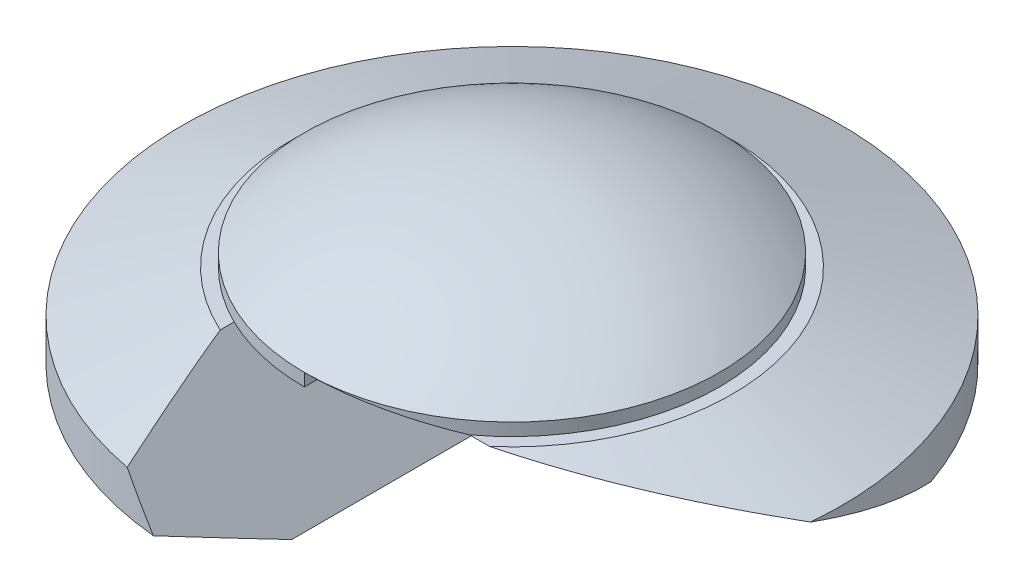
ISO-10303-21;
HEADER;
FILE_DESCRIPTION(('STEP AP214'),'2;1');
FILE_NAME('part.step','',(''),(''),'','','');
FILE_SCHEMA(('AUTOMOTIVE_DESIGN { 1 0 10303 214 1 1 1 1 }'));
ENDSEC;
DATA;
#1=APPLICATION_CONTEXT('core data for automotive mechanical design processes');
#2=APPLICATION_PROTOCOL_DEFINITION('international standard','automotive_design',2000,#1);
#3=PRODUCT_CONTEXT('',#1,'mechanical');
#4=PRODUCT('Part','Part','',(#3));
#5=PRODUCT_RELATED_PRODUCT_CATEGORY('part','',(#4));
#6=PRODUCT_DEFINITION_FORMATION('','',#4);
#7=PRODUCT_DEFINITION_CONTEXT('part definition',#1,'design');
#8=PRODUCT_DEFINITION('design','',#6,#7);
#9=PRODUCT_DEFINITION_SHAPE('','',#8);
#10=(LENGTH_UNIT() NAMED_UNIT(*) SI_UNIT(.MILLI.,.METRE.));
#11=(NAMED_UNIT(*) PLANE_ANGLE_UNIT() SI_UNIT($,.RADIAN.));
#12=(NAMED_UNIT(*) SI_UNIT($,.STERADIAN.) SOLID_ANGLE_UNIT());
#13=UNCERTAINTY_MEASURE_WITH_UNIT(LENGTH_MEASURE(1.E-05),#10,'distance_accuracy_value','');
#14=(GEOMETRIC_REPRESENTATION_CONTEXT(3) GLOBAL_UNCERTAINTY_ASSIGNED_CONTEXT((#13)) GLOBAL_UNIT_ASSIGNED_CONTEXT((#10,
#11,#12)) REPRESENTATION_CONTEXT('',''));
#15=CARTESIAN_POINT('',(0.,0.,0.));
#16=DIRECTION('',(0.,0.,1.));
#17=DIRECTION('',(1.,0.,0.));
#18=AXIS2_PLACEMENT_3D('',#15,#16,#17);
#19=CARTESIAN_POINT('',(0.,0.,0.));
#20=DIRECTION('',(0.,1.,0.));
#21=DIRECTION('',(0.,0.,1.));
#22=AXIS2_PLACEMENT_3D('',#19,#20,#21);
#23=CONICAL_SURFACE('',#22,52.5,1.20427718387609);
#24=CARTESIAN_POINT('',(-7.26557058855918,10.0002,78.2146773856919));
#25=CARTESIAN_POINT('',(-6.96065699461388,9.5805224419878,77.1449928959618));
#26=CARTESIAN_POINT('',(-6.65592661182675,9.16109705250133,76.0751572318501));
#27=CARTESIAN_POINT('',(-6.04688546122604,8.32282382399154,73.9351400368008));
#28=CARTESIAN_POINT('',(-5.74257469348366,7.90397598506623,72.8649585058045));
#29=CARTESIAN_POINT('',(-4.83035442984562,6.64841250670738,69.6538397887752));
#30=CARTESIAN_POINT('',(-4.22315429235041,5.81267321535136,67.5123190767191));
#31=CARTESIAN_POINT('',(-3.01122407466041,4.14459437485014,63.2272482963205));
#32=CARTESIAN_POINT('',(-2.40649400007271,3.31225483342245,61.0836982233849));
#33=CARTESIAN_POINT('',(-1.50189762900108,2.06718474295562,57.866333879817));
#34=CARTESIAN_POINT('',(-1.20078132215425,1.65273370225258,56.7935369345922));
#35=CARTESIAN_POINT('',(-0.599537473203245,0.82519253876192,54.6471405358259));
#36=CARTESIAN_POINT('',(-0.29940993179118,0.412102416926889,53.5735410817233));
#37=CARTESIAN_POINT('',(0.000145308505600013,-0.000199999999998544,52.499478981986));
#38=B_SPLINE_CURVE_WITH_KNOTS('',3,(#24,#25,#26,#27,#28,#29,#30,#31,#32,#33,#34,#35,#36,#37),
.UNSPECIFIED.,.F.,.F.,(4,2,2,2,2,2,4),(0.,3.56650216730053,7.1330049397686,14.2659791344243,
21.398969512092,24.9654799238221,28.5319928314626),.UNSPECIFIED.);
#39=CARTESIAN_POINT('',(-7.26542528005358,10.,78.2141676227984));
#40=VERTEX_POINT('',#39);
#41=CARTESIAN_POINT('',(0.,0.,52.5));
#42=VERTEX_POINT('',#41);
#43=EDGE_CURVE('E153',#40,#42,#38,.T.);
#44=ORIENTED_EDGE('',*,*,#43,.F.);
#45=CARTESIAN_POINT('',(0.,10.,0.));
#46=DIRECTION('',(0.,1.,0.));
#47=DIRECTION('',(0.,0.,1.));
#48=AXIS2_PLACEMENT_3D('',#45,#46,#47);
#49=CIRCLE('',#48,78.5508906469382);
#50=CARTESIAN_POINT('',(74.2557063571241,10.,-25.6189869985487));
#51=VERTEX_POINT('',#50);
#52=EDGE_CURVE('E45',#51,#40,#49,.T.);
#53=ORIENTED_EDGE('',*,*,#52,.F.);
#54=CARTESIAN_POINT('',(0.,84.2948756402153,217.031265056935));
#55=DIRECTION('',(0.,-0.956184307517342,0.292765383981067));
#56=DIRECTION('',(0.,0.292765383981067,0.956184307517342));
#57=AXIS2_PLACEMENT_3D('',#54,#55,#56);
#58=ELLIPSE('',#57,284.564028713801,164.11422087366);
#59=CARTESIAN_POINT('',(-0.715768534638702,0.985170870318859,-55.0618057892728));
#60=VERTEX_POINT('',#59);
#61=EDGE_CURVE('E61',#60,#51,#58,.T.);
#62=ORIENTED_EDGE('',*,*,#61,.F.);
#63=CARTESIAN_POINT('',(0.000145308505601796,-0.000200000000000998,-52.499478981986));
#64=CARTESIAN_POINT('',(-0.134287963043427,0.184831524469874,-52.9815017301759));
#65=CARTESIAN_POINT('',(-0.268838213561737,0.370024056678145,-53.4634300206551));
#66=CARTESIAN_POINT('',(-0.538156490143787,0.740708863418134,-54.4271101445566));
#67=CARTESIAN_POINT('',(-0.67292451609601,0.926201137796365,-54.9088619780691));
#68=CARTESIAN_POINT('',(-0.942662289053152,1.29746333176274,-55.8722021049945));
#69=CARTESIAN_POINT('',(-1.07763203604346,1.48323325133077,-56.3537903984192));
#70=CARTESIAN_POINT('',(-1.34775941792712,1.85503169597965,-57.316814747842));
#71=CARTESIAN_POINT('',(-1.48291705291659,2.0410602211928,-57.7982508037619));
#72=CARTESIAN_POINT('',(-1.6181616413759,2.22720842758976,-58.2796161283524));
#73=B_SPLINE_CURVE_WITH_KNOTS('',3,(#63,#64,#65,#66,#67,#68,#69,#70,#71,#72),.UNSPECIFIED.,.F.,
.F.,(4,2,2,2,4),(0.,1.60059171326443,3.20118260718026,4.80177338519164,6.40236498236349),.UNSPECIFIED.);
#74=CARTESIAN_POINT('',(0.,0.,-52.5));
#75=VERTEX_POINT('',#74);
#76=EDGE_CURVE('E121',#75,#60,#73,.T.);
#77=ORIENTED_EDGE('',*,*,#76,.F.);
#78=CARTESIAN_POINT('',(0.,0.,0.));
#79=DIRECTION('',(0.,1.,0.));
#80=DIRECTION('',(0.,0.,1.));
#81=AXIS2_PLACEMENT_3D('',#78,#79,#80);
#82=CIRCLE('',#81,52.5);
#83=EDGE_CURVE('E140',#75,#42,#82,.T.);
#84=ORIENTED_EDGE('',*,*,#83,.T.);
#85=EDGE_LOOP('',(#44,#53,#62,#77,#84));
#86=FACE_BOUND('',#85,.T.);
#87=ADVANCED_FACE('F36',(#86),#23,.T.);
#88=CARTESIAN_POINT('',(0.,20.,0.));
#89=DIRECTION('',(0.,-1.,0.));
#90=DIRECTION('',(0.,0.,-1.));
#91=AXIS2_PLACEMENT_3D('',#88,#89,#90);
#92=CYLINDRICAL_SURFACE('',#91,78.5508906469382);
#93=CARTESIAN_POINT('',(0.,0.,0.));
#94=DIRECTION('',(0.809016994374948,0.587785252292472,0.));
#95=DIRECTION('',(0.587785252292472,-0.809016994374949,0.));
#96=AXIS2_PLACEMENT_3D('',#93,#94,#95);
#97=ELLIPSE('',#96,133.638757251182,78.5508906469382);
#98=CARTESIAN_POINT('',(-14.5308505601072,20.,77.195186400624));
#99=VERTEX_POINT('',#98);
#100=EDGE_CURVE('E148',#99,#40,#97,.T.);
#101=ORIENTED_EDGE('',*,*,#100,.F.);
#102=CARTESIAN_POINT('',(0.,20.,0.));
#103=DIRECTION('',(0.,1.,0.));
#104=DIRECTION('',(0.,0.,1.));
#105=AXIS2_PLACEMENT_3D('',#102,#103,#104);
#106=CIRCLE('',#105,78.5508906469382);
#107=CARTESIAN_POINT('',(78.2346503420283,20.,7.04144213125515));
#108=VERTEX_POINT('',#107);
#109=EDGE_CURVE('E137',#108,#99,#106,.T.);
#110=ORIENTED_EDGE('',*,*,#109,.F.);
#111=CARTESIAN_POINT('',(0.,17.8440448215576,0.));
#112=DIRECTION('',(0.,-0.956184307517342,0.292765383981067));
#113=DIRECTION('',(0.,-0.292765383981067,-0.956184307517342));
#114=AXIS2_PLACEMENT_3D('',#111,#112,#113);
#115=ELLIPSE('',#114,82.1503658127265,78.5508906469382);
#116=EDGE_CURVE('E131',#51,#108,#115,.T.);
#117=ORIENTED_EDGE('',*,*,#116,.F.);
#118=ORIENTED_EDGE('',*,*,#52,.T.);
#119=EDGE_LOOP('',(#101,#110,#117,#118));
#120=FACE_BOUND('',#119,.T.);
#121=ADVANCED_FACE('F146',(#120),#92,.T.);
#122=CARTESIAN_POINT('',(0.,20.,0.));
#123=DIRECTION('',(0.,-1.,0.));
#124=DIRECTION('',(0.,0.,1.));
#125=AXIS2_PLACEMENT_3D('',#122,#123,#124);
#126=CONICAL_SURFACE('',#125,78.5508906469382,1.20427718387609);
#127=CARTESIAN_POINT('',(-21.7964211486663,30.0002,47.7609811301136));
#128=CARTESIAN_POINT('',(-21.6553364249193,29.8060135369799,48.3814207960381));
#129=CARTESIAN_POINT('',(-21.513330399386,29.6105590108379,49.0012520947269));
#130=CARTESIAN_POINT('',(-21.2276077254458,29.217295488158,50.239769944128));
#131=CARTESIAN_POINT('',(-21.0838910835059,29.019486500521,50.8584564991576));
#132=CARTESIAN_POINT('',(-20.6503778916726,28.422806780996,52.712887106151));
#133=CARTESIAN_POINT('',(-20.3582119136973,28.020674811134,53.947029141683));
#134=CARTESIAN_POINT('',(-19.768493167795,27.2089965911111,56.4113806083393));
#135=CARTESIAN_POINT('',(-19.4709411375201,26.7994513562412,57.6415905512374));
#136=CARTESIAN_POINT('',(-18.8711452323893,25.9739031164465,60.0987014838995));
#137=CARTESIAN_POINT('',(-18.5689013306258,25.5579000744866,61.3256024546394));
#138=CARTESIAN_POINT('',(-17.960363764,24.7203199698553,63.7763792405947));
#139=CARTESIAN_POINT('',(-17.6540704159419,24.2987433432275,65.0002552836739));
#140=CARTESIAN_POINT('',(-17.0379276949563,23.450695641633,67.4454112826156));
#141=CARTESIAN_POINT('',(-16.7280783246679,23.0242245702986,68.6666912404039));
#142=CARTESIAN_POINT('',(-16.1052200489097,22.1669337005293,71.1071173948413));
#143=CARTESIAN_POINT('',(-15.7922107097885,21.7361133052243,72.3262632709288));
#144=CARTESIAN_POINT('',(-15.1634357157402,20.8706787713718,74.7624899159501));
#145=CARTESIAN_POINT('',(-14.8476700731645,20.4360646498246,75.9795706941086));
#146=CARTESIAN_POINT('',(-14.5307052516016,19.9998,77.1957439203502));
#147=B_SPLINE_CURVE_WITH_KNOTS('',3,(#127,#128,#129,#130,#131,#132,#133,#134,#135,#136,#137,
#138,#139,#140,#141,#142,#143,#144,#145,#146),.UNSPECIFIED.,.F.,.F.,(4,2,2,2,2,2,2,2,2,4),(0.,
1.99574731480853,3.99148708723032,7.98287962721765,11.9737295972032,15.9646024629918,
19.955164933203,23.945724441989,27.9368392393206,31.927936161011),.UNSPECIFIED.);
#148=CARTESIAN_POINT('',(-21.7962758401607,30.,47.7616201515361));
#149=VERTEX_POINT('',#148);
#150=EDGE_CURVE('E158',#149,#99,#147,.T.);
#151=ORIENTED_EDGE('',*,*,#150,.F.);
#152=CARTESIAN_POINT('',(0.,30.,0.));
#153=DIRECTION('',(0.,1.,0.));
#154=DIRECTION('',(0.,0.,1.));
#155=AXIS2_PLACEMENT_3D('',#152,#153,#154);
#156=CIRCLE('',#155,52.5);
#157=CARTESIAN_POINT('',(34.3512942750387,30.,39.7018712610589));
#158=VERTEX_POINT('',#157);
#159=EDGE_CURVE('E134',#158,#149,#156,.T.);
#160=ORIENTED_EDGE('',*,*,#159,.F.);
#161=CARTESIAN_POINT('',(0.,-38.6591793161385,-184.541954755464));
#162=DIRECTION('',(0.,-0.956184307517342,0.292765383981067));
#163=DIRECTION('',(0.,-0.292765383981067,-0.956184307517342));
#164=AXIS2_PLACEMENT_3D('',#161,#162,#163);
#165=ELLIPSE('',#164,241.965147731865,139.546526235518);
#166=EDGE_CURVE('E129',#108,#158,#165,.T.);
#167=ORIENTED_EDGE('',*,*,#166,.F.);
#168=ORIENTED_EDGE('',*,*,#109,.T.);
#169=EDGE_LOOP('',(#151,#160,#167,#168));
#170=FACE_BOUND('',#169,.T.);
#171=ADVANCED_FACE('F186',(#170),#126,.T.);
#172=CARTESIAN_POINT('',(0.,30.,0.));
#173=DIRECTION('',(0.,1.,0.));
#174=DIRECTION('',(0.,0.,1.));
#175=AXIS2_PLACEMENT_3D('',#172,#173,#174);
#176=PLANE('',#175);
#177=ORIENTED_EDGE('',*,*,#159,.T.);
#178=DIRECTION('',(0.,0.,1.));
#179=VECTOR('',#178,1.);
#180=CARTESIAN_POINT('',(-21.7962758401607,30.,-91.1604338898328));
#181=LINE('',#180,#179);
#182=CARTESIAN_POINT('',(-21.7962758401607,30.,44.4429112401475));
#183=VERTEX_POINT('',#182);
#184=EDGE_CURVE('E273',#183,#149,#181,.T.);
#185=ORIENTED_EDGE('',*,*,#184,.F.);
#186=CARTESIAN_POINT('',(0.,30.,0.));
#187=DIRECTION('',(0.,1.,0.));
#188=DIRECTION('',(0.,0.,1.));
#189=AXIS2_PLACEMENT_3D('',#186,#187,#188);
#190=CIRCLE('',#189,49.5);
#191=CARTESIAN_POINT('',(29.5636841136268,30.,39.7018712610589));
#192=VERTEX_POINT('',#191);
#193=EDGE_CURVE('E11',#192,#183,#190,.T.);
#194=ORIENTED_EDGE('',*,*,#193,.F.);
#195=DIRECTION('',(1.,0.,0.));
#196=VECTOR('',#195,1.);
#197=CARTESIAN_POINT('',(0.,30.,39.7018712610589));
#198=LINE('',#197,#196);
#199=EDGE_CURVE('E126',#192,#158,#198,.T.);
#200=ORIENTED_EDGE('',*,*,#199,.T.);
#201=EDGE_LOOP('',(#177,#185,#194,#200));
#202=FACE_BOUND('',#201,.T.);
#203=ADVANCED_FACE('F191',(#202),#176,.T.);
#204=CARTESIAN_POINT('',(0.,0.,0.));
#205=DIRECTION('',(1.,0.,0.));
#206=DIRECTION('',(0.,0.,-1.));
#207=AXIS2_PLACEMENT_3D('',#204,#205,#206);
#208=PLANE('',#207);
#209=DIRECTION('',(0.,-1.,0.));
#210=VECTOR('',#209,1.);
#211=CARTESIAN_POINT('',(0.,33.,49.5));
#212=LINE('',#211,#210);
#213=CARTESIAN_POINT('',(0.,33.,49.5));
#214=VERTEX_POINT('',#213);
#215=CARTESIAN_POINT('',(0.,30.,49.5));
#216=VERTEX_POINT('',#215);
#217=EDGE_CURVE('E113',#214,#216,#212,.T.);
#218=ORIENTED_EDGE('',*,*,#217,.T.);
#219=DIRECTION('',(0.,0.,1.));
#220=VECTOR('',#219,1.);
#221=CARTESIAN_POINT('',(0.,30.,-91.1604338898328));
#222=LINE('',#221,#220);
#223=CARTESIAN_POINT('',(0.,30.,39.7018712610589));
#224=VERTEX_POINT('',#223);
#225=EDGE_CURVE('E104',#224,#216,#222,.T.);
#226=ORIENTED_EDGE('',*,*,#225,.F.);
#227=DIRECTION('',(0.,0.292765383981067,0.956184307517342));
#228=VECTOR('',#227,1.);
#229=CARTESIAN_POINT('',(0.,33.,49.5));
#230=LINE('',#229,#228);
#231=EDGE_CURVE('E53',#224,#214,#230,.T.);
#232=ORIENTED_EDGE('',*,*,#231,.T.);
#233=EDGE_LOOP('',(#218,#226,#232));
#234=FACE_BOUND('',#233,.T.);
#235=ADVANCED_FACE('F111',(#234),#208,.T.);
#236=CARTESIAN_POINT('',(0.,0.,0.));
#237=DIRECTION('',(0.,1.,0.));
#238=DIRECTION('',(0.,0.,1.));
#239=AXIS2_PLACEMENT_3D('',#236,#237,#238);
#240=PLANE('',#239);
#241=DIRECTION('',(0.,0.,-1.));
#242=VECTOR('',#241,1.);
#243=CARTESIAN_POINT('',(0.,0.,52.5));
#244=LINE('',#243,#242);
#245=EDGE_CURVE('E118',#42,#75,#244,.T.);
#246=ORIENTED_EDGE('',*,*,#245,.F.);
#247=ORIENTED_EDGE('',*,*,#83,.F.);
#248=EDGE_LOOP('',(#246,#247));
#249=FACE_BOUND('',#248,.T.);
#250=ADVANCED_FACE('F195',(#249),#240,.F.);
#251=CARTESIAN_POINT('',(0.,33.,0.));
#252=DIRECTION('',(0.,-1.,0.));
#253=DIRECTION('',(0.,0.,-1.));
#254=AXIS2_PLACEMENT_3D('',#251,#252,#253);
#255=CYLINDRICAL_SURFACE('',#254,49.5);
#256=CARTESIAN_POINT('',(0.,17.8440448215576,0.));
#257=DIRECTION('',(0.,-0.956184307517342,0.292765383981067));
#258=DIRECTION('',(0.,-0.292765383981067,-0.956184307517342));
#259=AXIS2_PLACEMENT_3D('',#256,#257,#258);
#260=ELLIPSE('',#259,51.768262259525,49.5);
#261=EDGE_CURVE('E117',#192,#214,#260,.T.);
#262=ORIENTED_EDGE('',*,*,#261,.F.);
#263=ORIENTED_EDGE('',*,*,#193,.T.);
#264=CARTESIAN_POINT('',(0.,30.,0.));
#265=DIRECTION('',(0.,-1.,0.));
#266=DIRECTION('',(0.,0.,-1.));
#267=AXIS2_PLACEMENT_3D('',#264,#265,#266);
#268=CIRCLE('',#267,49.5);
#269=EDGE_CURVE('E108',#216,#183,#268,.T.);
#270=ORIENTED_EDGE('',*,*,#269,.F.);
#271=ORIENTED_EDGE('',*,*,#217,.F.);
#272=CARTESIAN_POINT('',(0.,33.,0.));
#273=DIRECTION('',(0.,1.,0.));
#274=DIRECTION('',(0.,0.,1.));
#275=AXIS2_PLACEMENT_3D('',#272,#273,#274);
#276=CIRCLE('',#275,49.5);
#277=EDGE_CURVE('E40',#214,#214,#276,.T.);
#278=ORIENTED_EDGE('',*,*,#277,.F.);
#279=EDGE_LOOP('',(#262,#263,#270,#271,#278));
#280=FACE_BOUND('',#279,.T.);
#281=ADVANCED_FACE('F197',(#280),#255,.T.);
#282=CARTESIAN_POINT('',(0.,-35.5703125,0.));
#283=DIRECTION('',(0.,0.,1.));
#284=DIRECTION('',(1.,0.,0.));
#285=AXIS2_PLACEMENT_3D('',#282,#283,#284);
#286=SPHERICAL_SURFACE('',#285,84.5703125);
#287=CARTESIAN_POINT('',(0.,-35.5703125,0.));
#288=DIRECTION('',(0.,1.,0.));
#289=DIRECTION('',(0.,0.,1.));
#290=AXIS2_PLACEMENT_3D('',#287,#288,#289);
#291=SPHERICAL_SURFACE('',#290,84.5703125);
#292=ORIENTED_EDGE('',*,*,#277,.T.);
#293=EDGE_LOOP('',(#292));
#294=FACE_BOUND('',#293,.T.);
#295=ADVANCED_FACE('F38',(#294),#291,.T.);
#296=CARTESIAN_POINT('',(78.5508906469382,33.,49.5));
#297=DIRECTION('',(0.,-0.956184307517342,0.292765383981067));
#298=DIRECTION('',(0.,-0.292765383981067,-0.956184307517342));
#299=AXIS2_PLACEMENT_3D('',#296,#297,#298);
#300=PLANE('',#299);
#301=ORIENTED_EDGE('',*,*,#61,.T.);
#302=ORIENTED_EDGE('',*,*,#116,.T.);
#303=ORIENTED_EDGE('',*,*,#166,.T.);
#304=ORIENTED_EDGE('',*,*,#199,.F.);
#305=ORIENTED_EDGE('',*,*,#261,.T.);
#306=ORIENTED_EDGE('',*,*,#231,.F.);
#307=DIRECTION('',(-1.,0.,0.));
#308=VECTOR('',#307,1.);
#309=CARTESIAN_POINT('',(-21.7962758401607,30.,39.7018712610589));
#310=LINE('',#309,#308);
#311=CARTESIAN_POINT('',(-21.7962758401607,30.,39.7018712610588));
#312=VERTEX_POINT('',#311);
#313=EDGE_CURVE('E102',#224,#312,#310,.T.);
#314=ORIENTED_EDGE('',*,*,#313,.T.);
#315=DIRECTION('',(0.208052008475355,-0.286359022983195,-0.935260857582248));
#316=VECTOR('',#315,1.);
#317=CARTESIAN_POINT('',(6.39808378665222,-8.80620684960789,-87.0408655997535));
#318=LINE('',#317,#316);
#319=EDGE_CURVE('E109',#312,#60,#318,.T.);
#320=ORIENTED_EDGE('',*,*,#319,.T.);
#321=EDGE_LOOP('',(#301,#302,#303,#304,#305,#306,#314,#320));
#322=FACE_BOUND('',#321,.T.);
#323=ADVANCED_FACE('F115',(#322),#300,.T.);
#324=CARTESIAN_POINT('',(0.,0.,-91.1604338898328));
#325=DIRECTION('',(0.809016994374948,0.587785252292472,0.));
#326=DIRECTION('',(-0.587785252292472,0.809016994374949,0.));
#327=AXIS2_PLACEMENT_3D('',#324,#325,#326);
#328=PLANE('',#327);
#329=ORIENTED_EDGE('',*,*,#76,.T.);
#330=ORIENTED_EDGE('',*,*,#319,.F.);
#331=EDGE_CURVE('E107',#312,#183,#181,.T.);
#332=ORIENTED_EDGE('',*,*,#331,.T.);
#333=ORIENTED_EDGE('',*,*,#184,.T.);
#334=ORIENTED_EDGE('',*,*,#150,.T.);
#335=ORIENTED_EDGE('',*,*,#100,.T.);
#336=ORIENTED_EDGE('',*,*,#43,.T.);
#337=ORIENTED_EDGE('',*,*,#245,.T.);
#338=EDGE_LOOP('',(#329,#330,#332,#333,#334,#335,#336,#337));
#339=FACE_BOUND('',#338,.T.);
#340=ADVANCED_FACE('F172',(#339),#328,.T.);
#341=CARTESIAN_POINT('',(-21.7962758401607,30.,-91.1604338898328));
#342=DIRECTION('',(0.,-1.,0.));
#343=DIRECTION('',(0.,0.,-1.));
#344=AXIS2_PLACEMENT_3D('',#341,#342,#343);
#345=PLANE('',#344);
#346=ORIENTED_EDGE('',*,*,#269,.T.);
#347=ORIENTED_EDGE('',*,*,#331,.F.);
#348=ORIENTED_EDGE('',*,*,#313,.F.);
#349=ORIENTED_EDGE('',*,*,#225,.T.);
#350=EDGE_LOOP('',(#346,#347,#348,#349));
#351=FACE_BOUND('',#350,.T.);
#352=ADVANCED_FACE('F103',(#351),#345,.T.);
#353=CLOSED_SHELL('',(#87,#121,#171,#203,#235,#250,#281,#295,#323,#340,#352));
#354=MANIFOLD_SOLID_BREP('B2',#353);
#355=ADVANCED_BREP_SHAPE_REPRESENTATION('',(#18,#354),#14);
#356=SHAPE_DEFINITION_REPRESENTATION(#9,#355);
ENDSEC;
END-ISO-10303-21;
